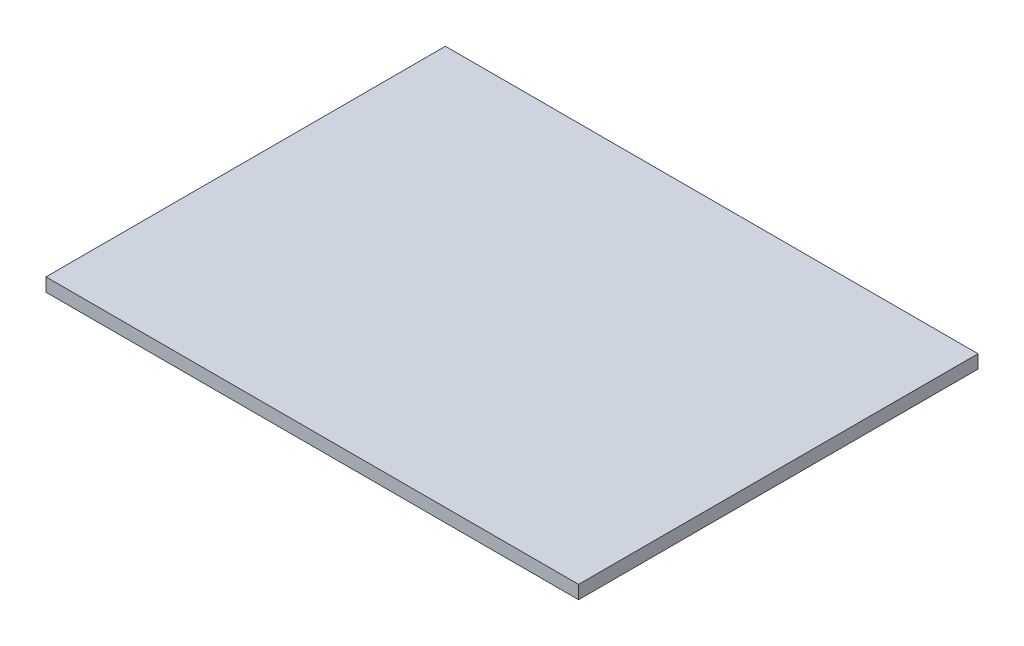
ISO-10303-21;
HEADER;
FILE_DESCRIPTION(('STEP AP214'),'2;1');
FILE_NAME('part.step','',(''),(''),'','','');
FILE_SCHEMA(('AUTOMOTIVE_DESIGN { 1 0 10303 214 1 1 1 1 }'));
ENDSEC;
DATA;
#1=APPLICATION_CONTEXT('core data for automotive mechanical design processes');
#2=APPLICATION_PROTOCOL_DEFINITION('international standard','automotive_design',2000,#1);
#3=PRODUCT_CONTEXT('',#1,'mechanical');
#4=PRODUCT('Part','Part','',(#3));
#5=PRODUCT_RELATED_PRODUCT_CATEGORY('part','',(#4));
#6=PRODUCT_DEFINITION_FORMATION('','',#4);
#7=PRODUCT_DEFINITION_CONTEXT('part definition',#1,'design');
#8=PRODUCT_DEFINITION('design','',#6,#7);
#9=PRODUCT_DEFINITION_SHAPE('','',#8);
#10=(LENGTH_UNIT() NAMED_UNIT(*) SI_UNIT(.MILLI.,.METRE.));
#11=(NAMED_UNIT(*) PLANE_ANGLE_UNIT() SI_UNIT($,.RADIAN.));
#12=(NAMED_UNIT(*) SI_UNIT($,.STERADIAN.) SOLID_ANGLE_UNIT());
#13=UNCERTAINTY_MEASURE_WITH_UNIT(LENGTH_MEASURE(1.E-05),#10,'distance_accuracy_value','');
#14=(GEOMETRIC_REPRESENTATION_CONTEXT(3) GLOBAL_UNCERTAINTY_ASSIGNED_CONTEXT((#13)) GLOBAL_UNIT_ASSIGNED_CONTEXT((#10,
#11,#12)) REPRESENTATION_CONTEXT('',''));
#15=CARTESIAN_POINT('',(0.,0.,0.));
#16=DIRECTION('',(0.,0.,1.));
#17=DIRECTION('',(1.,0.,0.));
#18=AXIS2_PLACEMENT_3D('',#15,#16,#17);
#19=CARTESIAN_POINT('',(100.,5.,75.));
#20=DIRECTION('',(-1.,0.,0.));
#21=DIRECTION('',(0.,0.,1.));
#22=AXIS2_PLACEMENT_3D('',#19,#20,#21);
#23=PLANE('',#22);
#24=DIRECTION('',(0.,0.,-1.));
#25=VECTOR('',#24,1.);
#26=CARTESIAN_POINT('',(100.,0.,75.));
#27=LINE('',#26,#25);
#28=CARTESIAN_POINT('',(100.,0.,75.));
#29=VERTEX_POINT('',#28);
#30=CARTESIAN_POINT('',(100.,0.,-75.));
#31=VERTEX_POINT('',#30);
#32=EDGE_CURVE('E98',#29,#31,#27,.T.);
#33=ORIENTED_EDGE('',*,*,#32,.T.);
#34=DIRECTION('',(0.,-1.,0.));
#35=VECTOR('',#34,1.);
#36=CARTESIAN_POINT('',(100.,5.,-75.));
#37=LINE('',#36,#35);
#38=CARTESIAN_POINT('',(100.,5.,-75.));
#39=VERTEX_POINT('',#38);
#40=EDGE_CURVE('E11',#39,#31,#37,.T.);
#41=ORIENTED_EDGE('',*,*,#40,.F.);
#42=DIRECTION('',(0.,0.,-1.));
#43=VECTOR('',#42,1.);
#44=CARTESIAN_POINT('',(100.,5.,75.));
#45=LINE('',#44,#43);
#46=CARTESIAN_POINT('',(100.,5.,75.));
#47=VERTEX_POINT('',#46);
#48=EDGE_CURVE('E86',#47,#39,#45,.T.);
#49=ORIENTED_EDGE('',*,*,#48,.F.);
#50=DIRECTION('',(0.,-1.,0.));
#51=VECTOR('',#50,1.);
#52=CARTESIAN_POINT('',(100.,5.,75.));
#53=LINE('',#52,#51);
#54=EDGE_CURVE('E94',#47,#29,#53,.T.);
#55=ORIENTED_EDGE('',*,*,#54,.T.);
#56=EDGE_LOOP('',(#33,#41,#49,#55));
#57=FACE_BOUND('',#56,.T.);
#58=ADVANCED_FACE('F35',(#57),#23,.F.);
#59=CARTESIAN_POINT('',(-100.,5.,-75.));
#60=DIRECTION('',(0.,0.,1.));
#61=DIRECTION('',(1.,0.,0.));
#62=AXIS2_PLACEMENT_3D('',#59,#60,#61);
#63=PLANE('',#62);
#64=DIRECTION('',(-1.,0.,0.));
#65=VECTOR('',#64,1.);
#66=CARTESIAN_POINT('',(-100.,0.,-75.));
#67=LINE('',#66,#65);
#68=CARTESIAN_POINT('',(-100.,0.,-75.));
#69=VERTEX_POINT('',#68);
#70=EDGE_CURVE('E90',#31,#69,#67,.T.);
#71=ORIENTED_EDGE('',*,*,#70,.T.);
#72=DIRECTION('',(0.,-1.,0.));
#73=VECTOR('',#72,1.);
#74=CARTESIAN_POINT('',(-100.,5.,-75.));
#75=LINE('',#74,#73);
#76=CARTESIAN_POINT('',(-100.,5.,-75.));
#77=VERTEX_POINT('',#76);
#78=EDGE_CURVE('E43',#77,#69,#75,.T.);
#79=ORIENTED_EDGE('',*,*,#78,.F.);
#80=DIRECTION('',(-1.,0.,0.));
#81=VECTOR('',#80,1.);
#82=CARTESIAN_POINT('',(-100.,5.,-75.));
#83=LINE('',#82,#81);
#84=EDGE_CURVE('E81',#39,#77,#83,.T.);
#85=ORIENTED_EDGE('',*,*,#84,.F.);
#86=ORIENTED_EDGE('',*,*,#40,.T.);
#87=EDGE_LOOP('',(#71,#79,#85,#86));
#88=FACE_BOUND('',#87,.T.);
#89=ADVANCED_FACE('F89',(#88),#63,.F.);
#90=CARTESIAN_POINT('',(-100.,5.,75.));
#91=DIRECTION('',(1.,0.,0.));
#92=DIRECTION('',(0.,0.,-1.));
#93=AXIS2_PLACEMENT_3D('',#90,#91,#92);
#94=PLANE('',#93);
#95=DIRECTION('',(0.,0.,1.));
#96=VECTOR('',#95,1.);
#97=CARTESIAN_POINT('',(-100.,0.,75.));
#98=LINE('',#97,#96);
#99=CARTESIAN_POINT('',(-100.,0.,75.));
#100=VERTEX_POINT('',#99);
#101=EDGE_CURVE('E68',#69,#100,#98,.T.);
#102=ORIENTED_EDGE('',*,*,#101,.T.);
#103=DIRECTION('',(0.,-1.,0.));
#104=VECTOR('',#103,1.);
#105=CARTESIAN_POINT('',(-100.,5.,75.));
#106=LINE('',#105,#104);
#107=CARTESIAN_POINT('',(-100.,5.,75.));
#108=VERTEX_POINT('',#107);
#109=EDGE_CURVE('E91',#108,#100,#106,.T.);
#110=ORIENTED_EDGE('',*,*,#109,.F.);
#111=DIRECTION('',(0.,0.,1.));
#112=VECTOR('',#111,1.);
#113=CARTESIAN_POINT('',(-100.,5.,75.));
#114=LINE('',#113,#112);
#115=EDGE_CURVE('E84',#77,#108,#114,.T.);
#116=ORIENTED_EDGE('',*,*,#115,.F.);
#117=ORIENTED_EDGE('',*,*,#78,.T.);
#118=EDGE_LOOP('',(#102,#110,#116,#117));
#119=FACE_BOUND('',#118,.T.);
#120=ADVANCED_FACE('F92',(#119),#94,.F.);
#121=CARTESIAN_POINT('',(-100.,5.,75.));
#122=DIRECTION('',(0.,0.,-1.));
#123=DIRECTION('',(-1.,0.,0.));
#124=AXIS2_PLACEMENT_3D('',#121,#122,#123);
#125=PLANE('',#124);
#126=DIRECTION('',(1.,0.,0.));
#127=VECTOR('',#126,1.);
#128=CARTESIAN_POINT('',(-100.,0.,75.));
#129=LINE('',#128,#127);
#130=EDGE_CURVE('E74',#100,#29,#129,.T.);
#131=ORIENTED_EDGE('',*,*,#130,.T.);
#132=ORIENTED_EDGE('',*,*,#54,.F.);
#133=DIRECTION('',(1.,0.,0.));
#134=VECTOR('',#133,1.);
#135=CARTESIAN_POINT('',(-100.,5.,75.));
#136=LINE('',#135,#134);
#137=EDGE_CURVE('E51',#108,#47,#136,.T.);
#138=ORIENTED_EDGE('',*,*,#137,.F.);
#139=ORIENTED_EDGE('',*,*,#109,.T.);
#140=EDGE_LOOP('',(#131,#132,#138,#139));
#141=FACE_BOUND('',#140,.T.);
#142=ADVANCED_FACE('F105',(#141),#125,.F.);
#143=CARTESIAN_POINT('',(0.,5.,0.));
#144=DIRECTION('',(0.,-1.,0.));
#145=DIRECTION('',(0.,0.,-1.));
#146=AXIS2_PLACEMENT_3D('',#143,#144,#145);
#147=PLANE('',#146);
#148=ORIENTED_EDGE('',*,*,#48,.T.);
#149=ORIENTED_EDGE('',*,*,#84,.T.);
#150=ORIENTED_EDGE('',*,*,#115,.T.);
#151=ORIENTED_EDGE('',*,*,#137,.T.);
#152=EDGE_LOOP('',(#148,#149,#150,#151));
#153=FACE_BOUND('',#152,.T.);
#154=ADVANCED_FACE('F82',(#153),#147,.F.);
#155=CARTESIAN_POINT('',(0.,0.,0.));
#156=DIRECTION('',(0.,-1.,0.));
#157=DIRECTION('',(0.,0.,-1.));
#158=AXIS2_PLACEMENT_3D('',#155,#156,#157);
#159=PLANE('',#158);
#160=ORIENTED_EDGE('',*,*,#32,.F.);
#161=ORIENTED_EDGE('',*,*,#130,.F.);
#162=ORIENTED_EDGE('',*,*,#101,.F.);
#163=ORIENTED_EDGE('',*,*,#70,.F.);
#164=EDGE_LOOP('',(#160,#161,#162,#163));
#165=FACE_BOUND('',#164,.T.);
#166=ADVANCED_FACE('F108',(#165),#159,.T.);
#167=CLOSED_SHELL('',(#58,#89,#120,#142,#154,#166));
#168=MANIFOLD_SOLID_BREP('B2',#167);
#169=ADVANCED_BREP_SHAPE_REPRESENTATION('',(#18,#168),#14);
#170=SHAPE_DEFINITION_REPRESENTATION(#9,#169);
ENDSEC;
END-ISO-10303-21;
